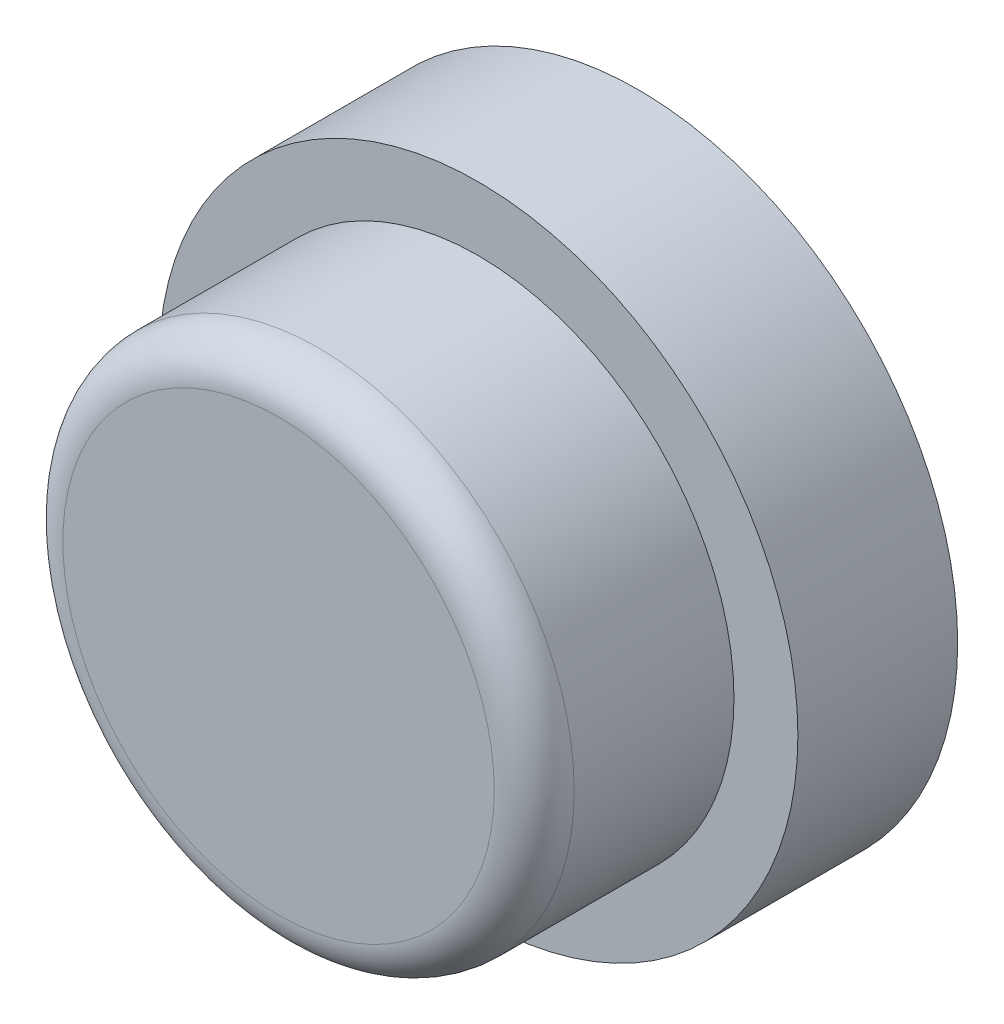
ISO-10303-21;
HEADER;
FILE_DESCRIPTION(('STEP AP214'),'2;1');
FILE_NAME('part.step','',(''),(''),'','','');
FILE_SCHEMA(('AUTOMOTIVE_DESIGN { 1 0 10303 214 1 1 1 1 }'));
ENDSEC;
DATA;
#1=APPLICATION_CONTEXT('core data for automotive mechanical design processes');
#2=APPLICATION_PROTOCOL_DEFINITION('international standard','automotive_design',2000,#1);
#3=PRODUCT_CONTEXT('',#1,'mechanical');
#4=PRODUCT('Part','Part','',(#3));
#5=PRODUCT_RELATED_PRODUCT_CATEGORY('part','',(#4));
#6=PRODUCT_DEFINITION_FORMATION('','',#4);
#7=PRODUCT_DEFINITION_CONTEXT('part definition',#1,'design');
#8=PRODUCT_DEFINITION('design','',#6,#7);
#9=PRODUCT_DEFINITION_SHAPE('','',#8);
#10=(LENGTH_UNIT() NAMED_UNIT(*) SI_UNIT(.MILLI.,.METRE.));
#11=(NAMED_UNIT(*) PLANE_ANGLE_UNIT() SI_UNIT($,.RADIAN.));
#12=(NAMED_UNIT(*) SI_UNIT($,.STERADIAN.) SOLID_ANGLE_UNIT());
#13=UNCERTAINTY_MEASURE_WITH_UNIT(LENGTH_MEASURE(1.E-05),#10,'distance_accuracy_value','');
#14=(GEOMETRIC_REPRESENTATION_CONTEXT(3) GLOBAL_UNCERTAINTY_ASSIGNED_CONTEXT((#13)) GLOBAL_UNIT_ASSIGNED_CONTEXT((#10,
#11,#12)) REPRESENTATION_CONTEXT('',''));
#15=CARTESIAN_POINT('',(0.,0.,0.));
#16=DIRECTION('',(0.,0.,1.));
#17=DIRECTION('',(1.,0.,0.));
#18=AXIS2_PLACEMENT_3D('',#15,#16,#17);
#19=CARTESIAN_POINT('',(0.,0.,0.));
#20=DIRECTION('',(0.,0.,1.));
#21=DIRECTION('',(1.,0.,0.));
#22=AXIS2_PLACEMENT_3D('',#19,#20,#21);
#23=PLANE('',#22);
#24=CARTESIAN_POINT('',(0.,0.,0.));
#25=DIRECTION('',(0.,0.,1.));
#26=DIRECTION('',(1.,0.,0.));
#27=AXIS2_PLACEMENT_3D('',#24,#25,#26);
#28=CIRCLE('',#27,5.4);
#29=CARTESIAN_POINT('',(5.4,0.,0.));
#30=VERTEX_POINT('',#29);
#31=EDGE_CURVE('E10',#30,#30,#28,.T.);
#32=ORIENTED_EDGE('',*,*,#31,.T.);
#33=EDGE_LOOP('',(#32));
#34=FACE_BOUND('',#33,.T.);
#35=ADVANCED_FACE('F31',(#34),#23,.T.);
#36=CARTESIAN_POINT('',(0.,0.,-1.));
#37=DIRECTION('',(0.,0.,1.));
#38=DIRECTION('',(1.,0.,0.));
#39=AXIS2_PLACEMENT_3D('',#36,#37,#38);
#40=TOROIDAL_SURFACE('',#39,5.4,1.);
#41=CARTESIAN_POINT('',(0.,0.,-1.));
#42=DIRECTION('',(0.,0.,1.));
#43=DIRECTION('',(1.,0.,0.));
#44=AXIS2_PLACEMENT_3D('',#41,#42,#43);
#45=CIRCLE('',#44,6.4);
#46=CARTESIAN_POINT('',(6.4,0.,-1.));
#47=VERTEX_POINT('',#46);
#48=EDGE_CURVE('E37',#47,#47,#45,.T.);
#49=ORIENTED_EDGE('',*,*,#48,.T.);
#50=EDGE_LOOP('',(#49));
#51=FACE_BOUND('',#50,.T.);
#52=ORIENTED_EDGE('',*,*,#31,.F.);
#53=EDGE_LOOP('',(#52));
#54=FACE_BOUND('',#53,.T.);
#55=ADVANCED_FACE('F69',(#51,#54),#40,.T.);
#56=CARTESIAN_POINT('',(0.,0.,0.));
#57=DIRECTION('',(0.,0.,1.));
#58=DIRECTION('',(1.,0.,0.));
#59=AXIS2_PLACEMENT_3D('',#56,#57,#58);
#60=CYLINDRICAL_SURFACE('',#59,6.4);
#61=CARTESIAN_POINT('',(0.,0.,-5.));
#62=DIRECTION('',(0.,0.,1.));
#63=DIRECTION('',(1.,0.,0.));
#64=AXIS2_PLACEMENT_3D('',#61,#62,#63);
#65=CIRCLE('',#64,6.4);
#66=CARTESIAN_POINT('',(6.4,0.,-5.));
#67=VERTEX_POINT('',#66);
#68=EDGE_CURVE('E41',#67,#67,#65,.T.);
#69=ORIENTED_EDGE('',*,*,#68,.T.);
#70=EDGE_LOOP('',(#69));
#71=FACE_BOUND('',#70,.T.);
#72=ORIENTED_EDGE('',*,*,#48,.F.);
#73=EDGE_LOOP('',(#72));
#74=FACE_BOUND('',#73,.T.);
#75=ADVANCED_FACE('F73',(#71,#74),#60,.T.);
#76=CARTESIAN_POINT('',(6.4,0.,-5.));
#77=DIRECTION('',(0.,0.,1.));
#78=DIRECTION('',(1.,0.,0.));
#79=AXIS2_PLACEMENT_3D('',#76,#77,#78);
#80=PLANE('',#79);
#81=CARTESIAN_POINT('',(0.,0.,-5.));
#82=DIRECTION('',(0.,0.,1.));
#83=DIRECTION('',(1.,0.,0.));
#84=AXIS2_PLACEMENT_3D('',#81,#82,#83);
#85=CIRCLE('',#84,8.);
#86=CARTESIAN_POINT('',(8.,0.,-5.));
#87=VERTEX_POINT('',#86);
#88=EDGE_CURVE('E45',#87,#87,#85,.T.);
#89=ORIENTED_EDGE('',*,*,#88,.T.);
#90=EDGE_LOOP('',(#89));
#91=FACE_BOUND('',#90,.T.);
#92=ORIENTED_EDGE('',*,*,#68,.F.);
#93=EDGE_LOOP('',(#92));
#94=FACE_BOUND('',#93,.T.);
#95=ADVANCED_FACE('F77',(#91,#94),#80,.T.);
#96=CARTESIAN_POINT('',(0.,0.,0.));
#97=DIRECTION('',(0.,0.,1.));
#98=DIRECTION('',(1.,0.,0.));
#99=AXIS2_PLACEMENT_3D('',#96,#97,#98);
#100=CYLINDRICAL_SURFACE('',#99,8.);
#101=CARTESIAN_POINT('',(0.,0.,-9.));
#102=DIRECTION('',(0.,0.,1.));
#103=DIRECTION('',(1.,0.,0.));
#104=AXIS2_PLACEMENT_3D('',#101,#102,#103);
#105=CIRCLE('',#104,8.);
#106=CARTESIAN_POINT('',(8.,0.,-9.));
#107=VERTEX_POINT('',#106);
#108=EDGE_CURVE('E50',#107,#107,#105,.T.);
#109=ORIENTED_EDGE('',*,*,#108,.T.);
#110=EDGE_LOOP('',(#109));
#111=FACE_BOUND('',#110,.T.);
#112=ORIENTED_EDGE('',*,*,#88,.F.);
#113=EDGE_LOOP('',(#112));
#114=FACE_BOUND('',#113,.T.);
#115=ADVANCED_FACE('F66',(#111,#114),#100,.T.);
#116=CARTESIAN_POINT('',(8.,0.,-9.));
#117=DIRECTION('',(0.,0.,-1.));
#118=DIRECTION('',(-1.,0.,0.));
#119=AXIS2_PLACEMENT_3D('',#116,#117,#118);
#120=PLANE('',#119);
#121=CARTESIAN_POINT('',(0.,0.,-9.));
#122=DIRECTION('',(0.,0.,1.));
#123=DIRECTION('',(1.,0.,0.));
#124=AXIS2_PLACEMENT_3D('',#121,#122,#123);
#125=CIRCLE('',#124,2.82842712474619);
#126=CARTESIAN_POINT('',(2.82842712474619,0.,-9.));
#127=VERTEX_POINT('',#126);
#128=EDGE_CURVE('E53',#127,#127,#125,.T.);
#129=ORIENTED_EDGE('',*,*,#128,.T.);
#130=EDGE_LOOP('',(#129));
#131=FACE_BOUND('',#130,.T.);
#132=ORIENTED_EDGE('',*,*,#108,.F.);
#133=EDGE_LOOP('',(#132));
#134=FACE_BOUND('',#133,.T.);
#135=ADVANCED_FACE('F57',(#131,#134),#120,.T.);
#136=CARTESIAN_POINT('',(0.,0.,-8.));
#137=DIRECTION('',(0.,0.,1.));
#138=DIRECTION('',(1.,0.,0.));
#139=AXIS2_PLACEMENT_3D('',#136,#137,#138);
#140=SPHERICAL_SURFACE('',#139,3.);
#141=ORIENTED_EDGE('',*,*,#128,.F.);
#142=EDGE_LOOP('',(#141));
#143=FACE_BOUND('',#142,.T.);
#144=ADVANCED_FACE('F60',(#143),#140,.T.);
#145=CLOSED_SHELL('',(#35,#55,#75,#95,#115,#135,#144));
#146=MANIFOLD_SOLID_BREP('B2',#145);
#147=ADVANCED_BREP_SHAPE_REPRESENTATION('',(#18,#146),#14);
#148=SHAPE_DEFINITION_REPRESENTATION(#9,#147);
ENDSEC;
END-ISO-10303-21;
